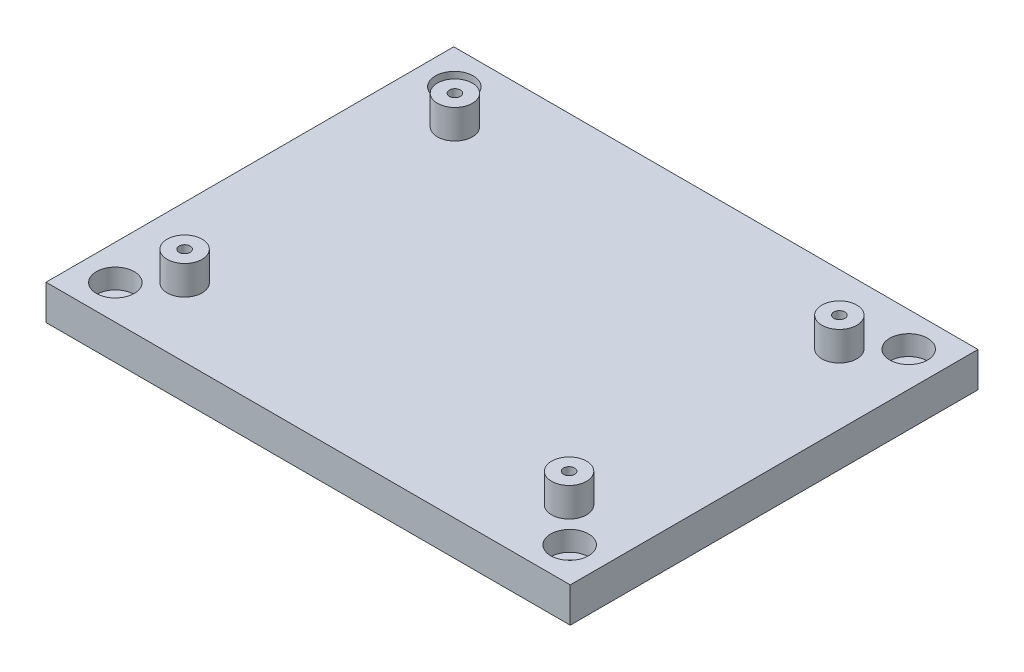
ISO-10303-21;
HEADER;
FILE_DESCRIPTION(('STEP AP214'),'2;1');
FILE_NAME('part.step','',(''),(''),'','','');
FILE_SCHEMA(('AUTOMOTIVE_DESIGN { 1 0 10303 214 1 1 1 1 }'));
ENDSEC;
DATA;
#1=APPLICATION_CONTEXT('core data for automotive mechanical design processes');
#2=APPLICATION_PROTOCOL_DEFINITION('international standard','automotive_design',2000,#1);
#3=PRODUCT_CONTEXT('',#1,'mechanical');
#4=PRODUCT('Part','Part','',(#3));
#5=PRODUCT_RELATED_PRODUCT_CATEGORY('part','',(#4));
#6=PRODUCT_DEFINITION_FORMATION('','',#4);
#7=PRODUCT_DEFINITION_CONTEXT('part definition',#1,'design');
#8=PRODUCT_DEFINITION('design','',#6,#7);
#9=PRODUCT_DEFINITION_SHAPE('','',#8);
#10=(LENGTH_UNIT() NAMED_UNIT(*) SI_UNIT(.MILLI.,.METRE.));
#11=(NAMED_UNIT(*) PLANE_ANGLE_UNIT() SI_UNIT($,.RADIAN.));
#12=(NAMED_UNIT(*) SI_UNIT($,.STERADIAN.) SOLID_ANGLE_UNIT());
#13=UNCERTAINTY_MEASURE_WITH_UNIT(LENGTH_MEASURE(1.E-05),#10,'distance_accuracy_value','');
#14=(GEOMETRIC_REPRESENTATION_CONTEXT(3) GLOBAL_UNCERTAINTY_ASSIGNED_CONTEXT((#13)) GLOBAL_UNIT_ASSIGNED_CONTEXT((#10,
#11,#12)) REPRESENTATION_CONTEXT('',''));
#15=CARTESIAN_POINT('',(0.,0.,0.));
#16=DIRECTION('',(0.,0.,1.));
#17=DIRECTION('',(1.,0.,0.));
#18=AXIS2_PLACEMENT_3D('',#15,#16,#17);
#19=CARTESIAN_POINT('',(-45.,6.,-35.));
#20=DIRECTION('',(1.,0.,0.));
#21=DIRECTION('',(0.,0.,-1.));
#22=AXIS2_PLACEMENT_3D('',#19,#20,#21);
#23=PLANE('',#22);
#24=DIRECTION('',(0.,0.,1.));
#25=VECTOR('',#24,1.);
#26=CARTESIAN_POINT('',(-45.,0.,-35.));
#27=LINE('',#26,#25);
#28=CARTESIAN_POINT('',(-45.,0.,-35.));
#29=VERTEX_POINT('',#28);
#30=CARTESIAN_POINT('',(-45.,0.,35.));
#31=VERTEX_POINT('',#30);
#32=EDGE_CURVE('E108',#29,#31,#27,.T.);
#33=ORIENTED_EDGE('',*,*,#32,.T.);
#34=DIRECTION('',(0.,-1.,0.));
#35=VECTOR('',#34,1.);
#36=CARTESIAN_POINT('',(-45.,6.,35.));
#37=LINE('',#36,#35);
#38=CARTESIAN_POINT('',(-45.,6.,35.));
#39=VERTEX_POINT('',#38);
#40=EDGE_CURVE('E99',#39,#31,#37,.T.);
#41=ORIENTED_EDGE('',*,*,#40,.F.);
#42=DIRECTION('',(0.,0.,1.));
#43=VECTOR('',#42,1.);
#44=CARTESIAN_POINT('',(-45.,6.,-35.));
#45=LINE('',#44,#43);
#46=CARTESIAN_POINT('',(-45.,6.,-35.));
#47=VERTEX_POINT('',#46);
#48=EDGE_CURVE('E93',#47,#39,#45,.T.);
#49=ORIENTED_EDGE('',*,*,#48,.F.);
#50=DIRECTION('',(0.,-1.,0.));
#51=VECTOR('',#50,1.);
#52=CARTESIAN_POINT('',(-45.,6.,-35.));
#53=LINE('',#52,#51);
#54=EDGE_CURVE('E104',#47,#29,#53,.T.);
#55=ORIENTED_EDGE('',*,*,#54,.T.);
#56=EDGE_LOOP('',(#33,#41,#49,#55));
#57=FACE_BOUND('',#56,.T.);
#58=ADVANCED_FACE('F39',(#57),#23,.F.);
#59=CARTESIAN_POINT('',(-45.,6.,35.));
#60=DIRECTION('',(0.,0.,-1.));
#61=DIRECTION('',(-1.,0.,0.));
#62=AXIS2_PLACEMENT_3D('',#59,#60,#61);
#63=PLANE('',#62);
#64=DIRECTION('',(1.,0.,0.));
#65=VECTOR('',#64,1.);
#66=CARTESIAN_POINT('',(-45.,0.,35.));
#67=LINE('',#66,#65);
#68=CARTESIAN_POINT('',(45.,0.,35.));
#69=VERTEX_POINT('',#68);
#70=EDGE_CURVE('E98',#31,#69,#67,.T.);
#71=ORIENTED_EDGE('',*,*,#70,.T.);
#72=DIRECTION('',(0.,-1.,0.));
#73=VECTOR('',#72,1.);
#74=CARTESIAN_POINT('',(45.,6.,35.));
#75=LINE('',#74,#73);
#76=CARTESIAN_POINT('',(45.,6.,35.));
#77=VERTEX_POINT('',#76);
#78=EDGE_CURVE('E96',#77,#69,#75,.T.);
#79=ORIENTED_EDGE('',*,*,#78,.F.);
#80=DIRECTION('',(1.,0.,0.));
#81=VECTOR('',#80,1.);
#82=CARTESIAN_POINT('',(-45.,6.,35.));
#83=LINE('',#82,#81);
#84=EDGE_CURVE('E88',#39,#77,#83,.T.);
#85=ORIENTED_EDGE('',*,*,#84,.F.);
#86=ORIENTED_EDGE('',*,*,#40,.T.);
#87=EDGE_LOOP('',(#71,#79,#85,#86));
#88=FACE_BOUND('',#87,.T.);
#89=ADVANCED_FACE('F97',(#88),#63,.F.);
#90=CARTESIAN_POINT('',(45.,6.,-35.));
#91=DIRECTION('',(-1.,0.,0.));
#92=DIRECTION('',(0.,0.,1.));
#93=AXIS2_PLACEMENT_3D('',#90,#91,#92);
#94=PLANE('',#93);
#95=DIRECTION('',(0.,0.,-1.));
#96=VECTOR('',#95,1.);
#97=CARTESIAN_POINT('',(45.,0.,-35.));
#98=LINE('',#97,#96);
#99=CARTESIAN_POINT('',(45.,0.,-35.));
#100=VERTEX_POINT('',#99);
#101=EDGE_CURVE('E74',#69,#100,#98,.T.);
#102=ORIENTED_EDGE('',*,*,#101,.T.);
#103=DIRECTION('',(0.,-1.,0.));
#104=VECTOR('',#103,1.);
#105=CARTESIAN_POINT('',(45.,6.,-35.));
#106=LINE('',#105,#104);
#107=CARTESIAN_POINT('',(45.,6.,-35.));
#108=VERTEX_POINT('',#107);
#109=EDGE_CURVE('E100',#108,#100,#106,.T.);
#110=ORIENTED_EDGE('',*,*,#109,.F.);
#111=DIRECTION('',(0.,0.,-1.));
#112=VECTOR('',#111,1.);
#113=CARTESIAN_POINT('',(45.,6.,-35.));
#114=LINE('',#113,#112);
#115=EDGE_CURVE('E91',#77,#108,#114,.T.);
#116=ORIENTED_EDGE('',*,*,#115,.F.);
#117=ORIENTED_EDGE('',*,*,#78,.T.);
#118=EDGE_LOOP('',(#102,#110,#116,#117));
#119=FACE_BOUND('',#118,.T.);
#120=ADVANCED_FACE('F102',(#119),#94,.F.);
#121=CARTESIAN_POINT('',(-45.,6.,-35.));
#122=DIRECTION('',(0.,0.,1.));
#123=DIRECTION('',(1.,0.,0.));
#124=AXIS2_PLACEMENT_3D('',#121,#122,#123);
#125=PLANE('',#124);
#126=DIRECTION('',(-1.,0.,0.));
#127=VECTOR('',#126,1.);
#128=CARTESIAN_POINT('',(-45.,0.,-35.));
#129=LINE('',#128,#127);
#130=EDGE_CURVE('E80',#100,#29,#129,.T.);
#131=ORIENTED_EDGE('',*,*,#130,.T.);
#132=ORIENTED_EDGE('',*,*,#54,.F.);
#133=DIRECTION('',(-1.,0.,0.));
#134=VECTOR('',#133,1.);
#135=CARTESIAN_POINT('',(-45.,6.,-35.));
#136=LINE('',#135,#134);
#137=EDGE_CURVE('E57',#108,#47,#136,.T.);
#138=ORIENTED_EDGE('',*,*,#137,.F.);
#139=ORIENTED_EDGE('',*,*,#109,.T.);
#140=EDGE_LOOP('',(#131,#132,#138,#139));
#141=FACE_BOUND('',#140,.T.);
#142=ADVANCED_FACE('F204',(#141),#125,.F.);
#143=CARTESIAN_POINT('',(0.,6.,0.));
#144=DIRECTION('',(0.,1.,0.));
#145=DIRECTION('',(0.,0.,1.));
#146=AXIS2_PLACEMENT_3D('',#143,#144,#145);
#147=PLANE('',#146);
#148=CARTESIAN_POINT('',(-39.,6.,-29.1));
#149=DIRECTION('',(0.,1.,0.));
#150=DIRECTION('',(0.,0.,1.));
#151=AXIS2_PLACEMENT_3D('',#148,#149,#150);
#152=CIRCLE('',#151,3.25);
#153=CARTESIAN_POINT('',(-39.,6.,-25.85));
#154=VERTEX_POINT('',#153);
#155=EDGE_CURVE('E536',#154,#154,#152,.T.);
#156=ORIENTED_EDGE('',*,*,#155,.F.);
#157=EDGE_LOOP('',(#156));
#158=FACE_BOUND('',#157,.T.);
#159=CARTESIAN_POINT('',(-39.,6.,29.1));
#160=DIRECTION('',(0.,1.,0.));
#161=DIRECTION('',(0.,0.,1.));
#162=AXIS2_PLACEMENT_3D('',#159,#160,#161);
#163=CIRCLE('',#162,3.25);
#164=CARTESIAN_POINT('',(-39.,6.,32.35));
#165=VERTEX_POINT('',#164);
#166=EDGE_CURVE('E150',#165,#165,#163,.T.);
#167=ORIENTED_EDGE('',*,*,#166,.F.);
#168=EDGE_LOOP('',(#167));
#169=FACE_BOUND('',#168,.T.);
#170=CARTESIAN_POINT('',(39.,6.,-29.1));
#171=DIRECTION('',(0.,1.,0.));
#172=DIRECTION('',(0.,0.,1.));
#173=AXIS2_PLACEMENT_3D('',#170,#171,#172);
#174=CIRCLE('',#173,3.25);
#175=CARTESIAN_POINT('',(39.,6.,-25.85));
#176=VERTEX_POINT('',#175);
#177=EDGE_CURVE('E137',#176,#176,#174,.T.);
#178=ORIENTED_EDGE('',*,*,#177,.F.);
#179=EDGE_LOOP('',(#178));
#180=FACE_BOUND('',#179,.T.);
#181=CARTESIAN_POINT('',(39.,6.,29.1));
#182=DIRECTION('',(0.,1.,0.));
#183=DIRECTION('',(0.,0.,1.));
#184=AXIS2_PLACEMENT_3D('',#181,#182,#183);
#185=CIRCLE('',#184,3.25);
#186=CARTESIAN_POINT('',(39.,6.,32.35));
#187=VERTEX_POINT('',#186);
#188=EDGE_CURVE('E133',#187,#187,#185,.T.);
#189=ORIENTED_EDGE('',*,*,#188,.F.);
#190=EDGE_LOOP('',(#189));
#191=FACE_BOUND('',#190,.T.);
#192=CARTESIAN_POINT('',(33.,6.,-23.2));
#193=DIRECTION('',(0.,1.,0.));
#194=DIRECTION('',(0.,0.,1.));
#195=AXIS2_PLACEMENT_3D('',#192,#193,#194);
#196=CIRCLE('',#195,3.);
#197=CARTESIAN_POINT('',(33.,6.,-20.2));
#198=VERTEX_POINT('',#197);
#199=EDGE_CURVE('E185',#198,#198,#196,.T.);
#200=ORIENTED_EDGE('',*,*,#199,.F.);
#201=EDGE_LOOP('',(#200));
#202=FACE_BOUND('',#201,.T.);
#203=CARTESIAN_POINT('',(33.,6.,23.2));
#204=DIRECTION('',(0.,1.,0.));
#205=DIRECTION('',(0.,0.,1.));
#206=AXIS2_PLACEMENT_3D('',#203,#204,#205);
#207=CIRCLE('',#206,3.);
#208=CARTESIAN_POINT('',(33.,6.,26.2));
#209=VERTEX_POINT('',#208);
#210=EDGE_CURVE('E176',#209,#209,#207,.T.);
#211=ORIENTED_EDGE('',*,*,#210,.F.);
#212=EDGE_LOOP('',(#211));
#213=FACE_BOUND('',#212,.T.);
#214=CARTESIAN_POINT('',(-33.,6.,23.2));
#215=DIRECTION('',(0.,1.,0.));
#216=DIRECTION('',(0.,0.,1.));
#217=AXIS2_PLACEMENT_3D('',#214,#215,#216);
#218=CIRCLE('',#217,3.);
#219=CARTESIAN_POINT('',(-33.,6.,26.2));
#220=VERTEX_POINT('',#219);
#221=EDGE_CURVE('E165',#220,#220,#218,.T.);
#222=ORIENTED_EDGE('',*,*,#221,.F.);
#223=EDGE_LOOP('',(#222));
#224=FACE_BOUND('',#223,.T.);
#225=CARTESIAN_POINT('',(-33.,6.,-23.2));
#226=DIRECTION('',(0.,1.,0.));
#227=DIRECTION('',(0.,0.,1.));
#228=AXIS2_PLACEMENT_3D('',#225,#226,#227);
#229=CIRCLE('',#228,3.);
#230=CARTESIAN_POINT('',(-33.,6.,-20.2));
#231=VERTEX_POINT('',#230);
#232=EDGE_CURVE('E194',#231,#231,#229,.T.);
#233=ORIENTED_EDGE('',*,*,#232,.F.);
#234=EDGE_LOOP('',(#233));
#235=FACE_BOUND('',#234,.T.);
#236=ORIENTED_EDGE('',*,*,#48,.T.);
#237=ORIENTED_EDGE('',*,*,#84,.T.);
#238=ORIENTED_EDGE('',*,*,#115,.T.);
#239=ORIENTED_EDGE('',*,*,#137,.T.);
#240=EDGE_LOOP('',(#236,#237,#238,#239));
#241=FACE_BOUND('',#240,.T.);
#242=ADVANCED_FACE('F89',(#158,#169,#180,#191,#202,#213,#224,#235,#241),#147,.T.);
#243=CARTESIAN_POINT('',(0.,0.,0.));
#244=DIRECTION('',(0.,1.,0.));
#245=DIRECTION('',(0.,0.,1.));
#246=AXIS2_PLACEMENT_3D('',#243,#244,#245);
#247=PLANE('',#246);
#248=CARTESIAN_POINT('',(-39.,0.,-29.1));
#249=DIRECTION('',(0.,1.,0.));
#250=DIRECTION('',(0.,0.,1.));
#251=AXIS2_PLACEMENT_3D('',#248,#249,#250);
#252=CIRCLE('',#251,1.6);
#253=CARTESIAN_POINT('',(-39.,0.,-27.5));
#254=VERTEX_POINT('',#253);
#255=EDGE_CURVE('E42',#254,#254,#252,.T.);
#256=ORIENTED_EDGE('',*,*,#255,.T.);
#257=EDGE_LOOP('',(#256));
#258=FACE_BOUND('',#257,.T.);
#259=CARTESIAN_POINT('',(-39.,0.,29.1));
#260=DIRECTION('',(0.,1.,0.));
#261=DIRECTION('',(0.,0.,1.));
#262=AXIS2_PLACEMENT_3D('',#259,#260,#261);
#263=CIRCLE('',#262,1.6);
#264=CARTESIAN_POINT('',(-39.,0.,30.7));
#265=VERTEX_POINT('',#264);
#266=EDGE_CURVE('E135',#265,#265,#263,.T.);
#267=ORIENTED_EDGE('',*,*,#266,.T.);
#268=EDGE_LOOP('',(#267));
#269=FACE_BOUND('',#268,.T.);
#270=CARTESIAN_POINT('',(39.,0.,-29.1));
#271=DIRECTION('',(0.,1.,0.));
#272=DIRECTION('',(0.,0.,1.));
#273=AXIS2_PLACEMENT_3D('',#270,#271,#272);
#274=CIRCLE('',#273,1.6);
#275=CARTESIAN_POINT('',(39.,0.,-27.5));
#276=VERTEX_POINT('',#275);
#277=EDGE_CURVE('E131',#276,#276,#274,.T.);
#278=ORIENTED_EDGE('',*,*,#277,.T.);
#279=EDGE_LOOP('',(#278));
#280=FACE_BOUND('',#279,.T.);
#281=CARTESIAN_POINT('',(39.,0.,29.1));
#282=DIRECTION('',(0.,1.,0.));
#283=DIRECTION('',(0.,0.,1.));
#284=AXIS2_PLACEMENT_3D('',#281,#282,#283);
#285=CIRCLE('',#284,1.6);
#286=CARTESIAN_POINT('',(39.,0.,30.7));
#287=VERTEX_POINT('',#286);
#288=EDGE_CURVE('E126',#287,#287,#285,.T.);
#289=ORIENTED_EDGE('',*,*,#288,.T.);
#290=EDGE_LOOP('',(#289));
#291=FACE_BOUND('',#290,.T.);
#292=ORIENTED_EDGE('',*,*,#32,.F.);
#293=ORIENTED_EDGE('',*,*,#130,.F.);
#294=ORIENTED_EDGE('',*,*,#101,.F.);
#295=ORIENTED_EDGE('',*,*,#70,.F.);
#296=EDGE_LOOP('',(#292,#293,#294,#295));
#297=FACE_BOUND('',#296,.T.);
#298=ADVANCED_FACE('F203',(#258,#269,#280,#291,#297),#247,.F.);
#299=CARTESIAN_POINT('',(-33.,11.,-23.2));
#300=DIRECTION('',(0.,1.,0.));
#301=DIRECTION('',(0.,0.,1.));
#302=AXIS2_PLACEMENT_3D('',#299,#300,#301);
#303=PLANE('',#302);
#304=CARTESIAN_POINT('',(-33.,11.,-23.2));
#305=DIRECTION('',(0.,1.,0.));
#306=DIRECTION('',(0.,0.,1.));
#307=AXIS2_PLACEMENT_3D('',#304,#305,#306);
#308=CIRCLE('',#307,3.);
#309=CARTESIAN_POINT('',(-33.,11.,-20.2));
#310=VERTEX_POINT('',#309);
#311=EDGE_CURVE('E111',#310,#310,#308,.T.);
#312=ORIENTED_EDGE('',*,*,#311,.T.);
#313=EDGE_LOOP('',(#312));
#314=FACE_BOUND('',#313,.T.);
#315=CARTESIAN_POINT('',(-33.,11.,-23.2));
#316=DIRECTION('',(0.,1.,0.));
#317=DIRECTION('',(0.,0.,1.));
#318=AXIS2_PLACEMENT_3D('',#315,#316,#317);
#319=CIRCLE('',#318,0.950000000000001);
#320=CARTESIAN_POINT('',(-33.,11.,-22.25));
#321=VERTEX_POINT('',#320);
#322=EDGE_CURVE('E175',#321,#321,#319,.T.);
#323=ORIENTED_EDGE('',*,*,#322,.F.);
#324=EDGE_LOOP('',(#323));
#325=FACE_BOUND('',#324,.T.);
#326=ADVANCED_FACE('F213',(#314,#325),#303,.T.);
#327=CARTESIAN_POINT('',(-33.,11.,-23.2));
#328=DIRECTION('',(0.,-1.,0.));
#329=DIRECTION('',(0.,0.,-1.));
#330=AXIS2_PLACEMENT_3D('',#327,#328,#329);
#331=CYLINDRICAL_SURFACE('',#330,3.);
#332=ORIENTED_EDGE('',*,*,#311,.F.);
#333=EDGE_LOOP('',(#332));
#334=FACE_BOUND('',#333,.T.);
#335=ORIENTED_EDGE('',*,*,#232,.T.);
#336=EDGE_LOOP('',(#335));
#337=FACE_BOUND('',#336,.T.);
#338=ADVANCED_FACE('F200',(#334,#337),#331,.T.);
#339=CARTESIAN_POINT('',(-33.,11.,-23.2));
#340=DIRECTION('',(0.,-1.,0.));
#341=DIRECTION('',(0.,0.,-1.));
#342=AXIS2_PLACEMENT_3D('',#339,#340,#341);
#343=CYLINDRICAL_SURFACE('',#342,0.950000000000001);
#344=ORIENTED_EDGE('',*,*,#322,.T.);
#345=EDGE_LOOP('',(#344));
#346=FACE_BOUND('',#345,.T.);
#347=CARTESIAN_POINT('',(-33.,6.,-23.2));
#348=DIRECTION('',(0.,1.,0.));
#349=DIRECTION('',(0.,0.,1.));
#350=AXIS2_PLACEMENT_3D('',#347,#348,#349);
#351=CIRCLE('',#350,0.950000000000001);
#352=CARTESIAN_POINT('',(-33.,6.,-22.25));
#353=VERTEX_POINT('',#352);
#354=EDGE_CURVE('E118',#353,#353,#351,.F.);
#355=ORIENTED_EDGE('',*,*,#354,.T.);
#356=EDGE_LOOP('',(#355));
#357=FACE_BOUND('',#356,.T.);
#358=ADVANCED_FACE('F227',(#346,#357),#343,.F.);
#359=ORIENTED_EDGE('',*,*,#354,.F.);
#360=EDGE_LOOP('',(#359));
#361=FACE_BOUND('',#360,.T.);
#362=ADVANCED_FACE('F208',(#361),#147,.T.);
#363=CARTESIAN_POINT('',(-33.,11.,23.2));
#364=DIRECTION('',(0.,1.,0.));
#365=DIRECTION('',(0.,0.,1.));
#366=AXIS2_PLACEMENT_3D('',#363,#364,#365);
#367=PLANE('',#366);
#368=CARTESIAN_POINT('',(-33.,11.,23.2));
#369=DIRECTION('',(0.,1.,0.));
#370=DIRECTION('',(0.,0.,1.));
#371=AXIS2_PLACEMENT_3D('',#368,#369,#370);
#372=CIRCLE('',#371,3.);
#373=CARTESIAN_POINT('',(-33.,11.,26.2));
#374=VERTEX_POINT('',#373);
#375=EDGE_CURVE('E169',#374,#374,#372,.T.);
#376=ORIENTED_EDGE('',*,*,#375,.T.);
#377=EDGE_LOOP('',(#376));
#378=FACE_BOUND('',#377,.T.);
#379=CARTESIAN_POINT('',(-33.,11.,23.2));
#380=DIRECTION('',(0.,1.,0.));
#381=DIRECTION('',(0.,0.,1.));
#382=AXIS2_PLACEMENT_3D('',#379,#380,#381);
#383=CIRCLE('',#382,0.950000000000001);
#384=CARTESIAN_POINT('',(-33.,11.,24.15));
#385=VERTEX_POINT('',#384);
#386=EDGE_CURVE('E168',#385,#385,#383,.T.);
#387=ORIENTED_EDGE('',*,*,#386,.F.);
#388=EDGE_LOOP('',(#387));
#389=FACE_BOUND('',#388,.T.);
#390=ADVANCED_FACE('F226',(#378,#389),#367,.T.);
#391=CARTESIAN_POINT('',(-33.,11.,23.2));
#392=DIRECTION('',(0.,-1.,0.));
#393=DIRECTION('',(0.,0.,-1.));
#394=AXIS2_PLACEMENT_3D('',#391,#392,#393);
#395=CYLINDRICAL_SURFACE('',#394,3.);
#396=ORIENTED_EDGE('',*,*,#375,.F.);
#397=EDGE_LOOP('',(#396));
#398=FACE_BOUND('',#397,.T.);
#399=ORIENTED_EDGE('',*,*,#221,.T.);
#400=EDGE_LOOP('',(#399));
#401=FACE_BOUND('',#400,.T.);
#402=ADVANCED_FACE('F285',(#398,#401),#395,.T.);
#403=CARTESIAN_POINT('',(-33.,11.,23.2));
#404=DIRECTION('',(0.,-1.,0.));
#405=DIRECTION('',(0.,0.,-1.));
#406=AXIS2_PLACEMENT_3D('',#403,#404,#405);
#407=CYLINDRICAL_SURFACE('',#406,0.950000000000001);
#408=ORIENTED_EDGE('',*,*,#386,.T.);
#409=EDGE_LOOP('',(#408));
#410=FACE_BOUND('',#409,.T.);
#411=CARTESIAN_POINT('',(-33.,6.,23.2));
#412=DIRECTION('',(0.,1.,0.));
#413=DIRECTION('',(0.,0.,1.));
#414=AXIS2_PLACEMENT_3D('',#411,#412,#413);
#415=CIRCLE('',#414,0.950000000000001);
#416=CARTESIAN_POINT('',(-33.,6.,24.15));
#417=VERTEX_POINT('',#416);
#418=EDGE_CURVE('E121',#417,#417,#415,.F.);
#419=ORIENTED_EDGE('',*,*,#418,.T.);
#420=EDGE_LOOP('',(#419));
#421=FACE_BOUND('',#420,.T.);
#422=ADVANCED_FACE('F294',(#410,#421),#407,.F.);
#423=ORIENTED_EDGE('',*,*,#418,.F.);
#424=EDGE_LOOP('',(#423));
#425=FACE_BOUND('',#424,.T.);
#426=ADVANCED_FACE('F229',(#425),#147,.T.);
#427=CARTESIAN_POINT('',(33.,11.,23.2));
#428=DIRECTION('',(0.,1.,0.));
#429=DIRECTION('',(0.,0.,1.));
#430=AXIS2_PLACEMENT_3D('',#427,#428,#429);
#431=PLANE('',#430);
#432=CARTESIAN_POINT('',(33.,11.,23.2));
#433=DIRECTION('',(0.,1.,0.));
#434=DIRECTION('',(0.,0.,1.));
#435=AXIS2_PLACEMENT_3D('',#432,#433,#434);
#436=CIRCLE('',#435,3.);
#437=CARTESIAN_POINT('',(33.,11.,26.2));
#438=VERTEX_POINT('',#437);
#439=EDGE_CURVE('E179',#438,#438,#436,.T.);
#440=ORIENTED_EDGE('',*,*,#439,.T.);
#441=EDGE_LOOP('',(#440));
#442=FACE_BOUND('',#441,.T.);
#443=CARTESIAN_POINT('',(33.,11.,23.2));
#444=DIRECTION('',(0.,1.,0.));
#445=DIRECTION('',(0.,0.,1.));
#446=AXIS2_PLACEMENT_3D('',#443,#444,#445);
#447=CIRCLE('',#446,0.950000000000001);
#448=CARTESIAN_POINT('',(33.,11.,24.15));
#449=VERTEX_POINT('',#448);
#450=EDGE_CURVE('E172',#449,#449,#447,.T.);
#451=ORIENTED_EDGE('',*,*,#450,.F.);
#452=EDGE_LOOP('',(#451));
#453=FACE_BOUND('',#452,.T.);
#454=ADVANCED_FACE('F311',(#442,#453),#431,.T.);
#455=CARTESIAN_POINT('',(33.,11.,23.2));
#456=DIRECTION('',(0.,-1.,0.));
#457=DIRECTION('',(0.,0.,-1.));
#458=AXIS2_PLACEMENT_3D('',#455,#456,#457);
#459=CYLINDRICAL_SURFACE('',#458,3.);
#460=ORIENTED_EDGE('',*,*,#439,.F.);
#461=EDGE_LOOP('',(#460));
#462=FACE_BOUND('',#461,.T.);
#463=ORIENTED_EDGE('',*,*,#210,.T.);
#464=EDGE_LOOP('',(#463));
#465=FACE_BOUND('',#464,.T.);
#466=ADVANCED_FACE('F318',(#462,#465),#459,.T.);
#467=CARTESIAN_POINT('',(33.,11.,23.2));
#468=DIRECTION('',(0.,-1.,0.));
#469=DIRECTION('',(0.,0.,-1.));
#470=AXIS2_PLACEMENT_3D('',#467,#468,#469);
#471=CYLINDRICAL_SURFACE('',#470,0.950000000000001);
#472=ORIENTED_EDGE('',*,*,#450,.T.);
#473=EDGE_LOOP('',(#472));
#474=FACE_BOUND('',#473,.T.);
#475=CARTESIAN_POINT('',(33.,6.,23.2));
#476=DIRECTION('',(0.,1.,0.));
#477=DIRECTION('',(0.,0.,1.));
#478=AXIS2_PLACEMENT_3D('',#475,#476,#477);
#479=CIRCLE('',#478,0.950000000000001);
#480=CARTESIAN_POINT('',(33.,6.,24.15));
#481=VERTEX_POINT('',#480);
#482=EDGE_CURVE('E48',#481,#481,#479,.F.);
#483=ORIENTED_EDGE('',*,*,#482,.T.);
#484=EDGE_LOOP('',(#483));
#485=FACE_BOUND('',#484,.T.);
#486=ADVANCED_FACE('F327',(#474,#485),#471,.F.);
#487=ORIENTED_EDGE('',*,*,#482,.F.);
#488=EDGE_LOOP('',(#487));
#489=FACE_BOUND('',#488,.T.);
#490=ADVANCED_FACE('F224',(#489),#147,.T.);
#491=CARTESIAN_POINT('',(33.,11.,-23.2));
#492=DIRECTION('',(0.,1.,0.));
#493=DIRECTION('',(0.,0.,1.));
#494=AXIS2_PLACEMENT_3D('',#491,#492,#493);
#495=PLANE('',#494);
#496=CARTESIAN_POINT('',(33.,11.,-23.2));
#497=DIRECTION('',(0.,1.,0.));
#498=DIRECTION('',(0.,0.,1.));
#499=AXIS2_PLACEMENT_3D('',#496,#497,#498);
#500=CIRCLE('',#499,3.);
#501=CARTESIAN_POINT('',(33.,11.,-20.2));
#502=VERTEX_POINT('',#501);
#503=EDGE_CURVE('E129',#502,#502,#500,.T.);
#504=ORIENTED_EDGE('',*,*,#503,.T.);
#505=EDGE_LOOP('',(#504));
#506=FACE_BOUND('',#505,.T.);
#507=CARTESIAN_POINT('',(33.,11.,-23.2));
#508=DIRECTION('',(0.,1.,0.));
#509=DIRECTION('',(0.,0.,1.));
#510=AXIS2_PLACEMENT_3D('',#507,#508,#509);
#511=CIRCLE('',#510,0.950000000000001);
#512=CARTESIAN_POINT('',(33.,11.,-22.25));
#513=VERTEX_POINT('',#512);
#514=EDGE_CURVE('E182',#513,#513,#511,.T.);
#515=ORIENTED_EDGE('',*,*,#514,.F.);
#516=EDGE_LOOP('',(#515));
#517=FACE_BOUND('',#516,.T.);
#518=ADVANCED_FACE('F344',(#506,#517),#495,.T.);
#519=CARTESIAN_POINT('',(33.,11.,-23.2));
#520=DIRECTION('',(0.,-1.,0.));
#521=DIRECTION('',(0.,0.,-1.));
#522=AXIS2_PLACEMENT_3D('',#519,#520,#521);
#523=CYLINDRICAL_SURFACE('',#522,3.);
#524=ORIENTED_EDGE('',*,*,#503,.F.);
#525=EDGE_LOOP('',(#524));
#526=FACE_BOUND('',#525,.T.);
#527=ORIENTED_EDGE('',*,*,#199,.T.);
#528=EDGE_LOOP('',(#527));
#529=FACE_BOUND('',#528,.T.);
#530=ADVANCED_FACE('F351',(#526,#529),#523,.T.);
#531=CARTESIAN_POINT('',(33.,11.,-23.2));
#532=DIRECTION('',(0.,-1.,0.));
#533=DIRECTION('',(0.,0.,-1.));
#534=AXIS2_PLACEMENT_3D('',#531,#532,#533);
#535=CYLINDRICAL_SURFACE('',#534,0.950000000000001);
#536=ORIENTED_EDGE('',*,*,#514,.T.);
#537=EDGE_LOOP('',(#536));
#538=FACE_BOUND('',#537,.T.);
#539=CARTESIAN_POINT('',(33.,6.,-23.2));
#540=DIRECTION('',(0.,1.,0.));
#541=DIRECTION('',(0.,0.,1.));
#542=AXIS2_PLACEMENT_3D('',#539,#540,#541);
#543=CIRCLE('',#542,0.950000000000001);
#544=CARTESIAN_POINT('',(33.,6.,-22.25));
#545=VERTEX_POINT('',#544);
#546=EDGE_CURVE('E11',#545,#545,#543,.F.);
#547=ORIENTED_EDGE('',*,*,#546,.T.);
#548=EDGE_LOOP('',(#547));
#549=FACE_BOUND('',#548,.T.);
#550=ADVANCED_FACE('F222',(#538,#549),#535,.F.);
#551=ORIENTED_EDGE('',*,*,#546,.F.);
#552=EDGE_LOOP('',(#551));
#553=FACE_BOUND('',#552,.T.);
#554=ADVANCED_FACE('F207',(#553),#147,.T.);
#555=CARTESIAN_POINT('',(39.,6.,29.1));
#556=DIRECTION('',(0.,1.,0.));
#557=DIRECTION('',(0.,0.,1.));
#558=AXIS2_PLACEMENT_3D('',#555,#556,#557);
#559=CYLINDRICAL_SURFACE('',#558,1.6);
#560=CARTESIAN_POINT('',(39.,2.6,29.1));
#561=DIRECTION('',(0.,1.,0.));
#562=DIRECTION('',(0.,0.,1.));
#563=AXIS2_PLACEMENT_3D('',#560,#561,#562);
#564=CIRCLE('',#563,1.6);
#565=CARTESIAN_POINT('',(39.,2.6,30.7));
#566=VERTEX_POINT('',#565);
#567=EDGE_CURVE('E130',#566,#566,#564,.T.);
#568=ORIENTED_EDGE('',*,*,#567,.T.);
#569=EDGE_LOOP('',(#568));
#570=FACE_BOUND('',#569,.T.);
#571=ORIENTED_EDGE('',*,*,#288,.F.);
#572=EDGE_LOOP('',(#571));
#573=FACE_BOUND('',#572,.T.);
#574=ADVANCED_FACE('F221',(#570,#573),#559,.F.);
#575=CARTESIAN_POINT('',(40.6,2.6,29.1));
#576=DIRECTION('',(0.,-1.,0.));
#577=DIRECTION('',(0.,0.,-1.));
#578=AXIS2_PLACEMENT_3D('',#575,#576,#577);
#579=PLANE('',#578);
#580=ORIENTED_EDGE('',*,*,#567,.F.);
#581=EDGE_LOOP('',(#580));
#582=FACE_BOUND('',#581,.T.);
#583=CARTESIAN_POINT('',(39.,2.6,29.1));
#584=DIRECTION('',(0.,1.,0.));
#585=DIRECTION('',(0.,0.,1.));
#586=AXIS2_PLACEMENT_3D('',#583,#584,#585);
#587=CIRCLE('',#586,3.25);
#588=CARTESIAN_POINT('',(39.,2.6,32.35));
#589=VERTEX_POINT('',#588);
#590=EDGE_CURVE('E160',#589,#589,#587,.T.);
#591=ORIENTED_EDGE('',*,*,#590,.T.);
#592=EDGE_LOOP('',(#591));
#593=FACE_BOUND('',#592,.T.);
#594=ADVANCED_FACE('F393',(#582,#593),#579,.F.);
#595=CARTESIAN_POINT('',(39.,6.,29.1));
#596=DIRECTION('',(0.,1.,0.));
#597=DIRECTION('',(0.,0.,1.));
#598=AXIS2_PLACEMENT_3D('',#595,#596,#597);
#599=CYLINDRICAL_SURFACE('',#598,3.25);
#600=ORIENTED_EDGE('',*,*,#590,.F.);
#601=EDGE_LOOP('',(#600));
#602=FACE_BOUND('',#601,.T.);
#603=ORIENTED_EDGE('',*,*,#188,.T.);
#604=EDGE_LOOP('',(#603));
#605=FACE_BOUND('',#604,.T.);
#606=ADVANCED_FACE('F402',(#602,#605),#599,.F.);
#607=CARTESIAN_POINT('',(39.,6.,-29.1));
#608=DIRECTION('',(0.,1.,0.));
#609=DIRECTION('',(0.,0.,1.));
#610=AXIS2_PLACEMENT_3D('',#607,#608,#609);
#611=CYLINDRICAL_SURFACE('',#610,1.6);
#612=CARTESIAN_POINT('',(39.,2.6,-29.1));
#613=DIRECTION('',(0.,1.,0.));
#614=DIRECTION('',(0.,0.,1.));
#615=AXIS2_PLACEMENT_3D('',#612,#613,#614);
#616=CIRCLE('',#615,1.6);
#617=CARTESIAN_POINT('',(39.,2.6,-27.5));
#618=VERTEX_POINT('',#617);
#619=EDGE_CURVE('E134',#618,#618,#616,.T.);
#620=ORIENTED_EDGE('',*,*,#619,.T.);
#621=EDGE_LOOP('',(#620));
#622=FACE_BOUND('',#621,.T.);
#623=ORIENTED_EDGE('',*,*,#277,.F.);
#624=EDGE_LOOP('',(#623));
#625=FACE_BOUND('',#624,.T.);
#626=ADVANCED_FACE('F411',(#622,#625),#611,.F.);
#627=CARTESIAN_POINT('',(40.6,2.6,-29.1));
#628=DIRECTION('',(0.,-1.,0.));
#629=DIRECTION('',(0.,0.,-1.));
#630=AXIS2_PLACEMENT_3D('',#627,#628,#629);
#631=PLANE('',#630);
#632=ORIENTED_EDGE('',*,*,#619,.F.);
#633=EDGE_LOOP('',(#632));
#634=FACE_BOUND('',#633,.T.);
#635=CARTESIAN_POINT('',(39.,2.6,-29.1));
#636=DIRECTION('',(0.,1.,0.));
#637=DIRECTION('',(0.,0.,1.));
#638=AXIS2_PLACEMENT_3D('',#635,#636,#637);
#639=CIRCLE('',#638,3.25);
#640=CARTESIAN_POINT('',(39.,2.6,-25.85));
#641=VERTEX_POINT('',#640);
#642=EDGE_CURVE('E142',#641,#641,#639,.T.);
#643=ORIENTED_EDGE('',*,*,#642,.T.);
#644=EDGE_LOOP('',(#643));
#645=FACE_BOUND('',#644,.T.);
#646=ADVANCED_FACE('F420',(#634,#645),#631,.F.);
#647=CARTESIAN_POINT('',(39.,6.,-29.1));
#648=DIRECTION('',(0.,1.,0.));
#649=DIRECTION('',(0.,0.,1.));
#650=AXIS2_PLACEMENT_3D('',#647,#648,#649);
#651=CYLINDRICAL_SURFACE('',#650,3.25);
#652=ORIENTED_EDGE('',*,*,#642,.F.);
#653=EDGE_LOOP('',(#652));
#654=FACE_BOUND('',#653,.T.);
#655=ORIENTED_EDGE('',*,*,#177,.T.);
#656=EDGE_LOOP('',(#655));
#657=FACE_BOUND('',#656,.T.);
#658=ADVANCED_FACE('F429',(#654,#657),#651,.F.);
#659=CARTESIAN_POINT('',(-39.,6.,29.1));
#660=DIRECTION('',(0.,1.,0.));
#661=DIRECTION('',(0.,0.,1.));
#662=AXIS2_PLACEMENT_3D('',#659,#660,#661);
#663=CYLINDRICAL_SURFACE('',#662,1.6);
#664=CARTESIAN_POINT('',(-39.,2.6,29.1));
#665=DIRECTION('',(0.,1.,0.));
#666=DIRECTION('',(0.,0.,1.));
#667=AXIS2_PLACEMENT_3D('',#664,#665,#666);
#668=CIRCLE('',#667,1.6);
#669=CARTESIAN_POINT('',(-39.,2.6,30.7));
#670=VERTEX_POINT('',#669);
#671=EDGE_CURVE('E138',#670,#670,#668,.T.);
#672=ORIENTED_EDGE('',*,*,#671,.T.);
#673=EDGE_LOOP('',(#672));
#674=FACE_BOUND('',#673,.T.);
#675=ORIENTED_EDGE('',*,*,#266,.F.);
#676=EDGE_LOOP('',(#675));
#677=FACE_BOUND('',#676,.T.);
#678=ADVANCED_FACE('F438',(#674,#677),#663,.F.);
#679=CARTESIAN_POINT('',(-37.4,2.6,29.1));
#680=DIRECTION('',(0.,-1.,0.));
#681=DIRECTION('',(0.,0.,-1.));
#682=AXIS2_PLACEMENT_3D('',#679,#680,#681);
#683=PLANE('',#682);
#684=ORIENTED_EDGE('',*,*,#671,.F.);
#685=EDGE_LOOP('',(#684));
#686=FACE_BOUND('',#685,.T.);
#687=CARTESIAN_POINT('',(-39.,2.6,29.1));
#688=DIRECTION('',(0.,1.,0.));
#689=DIRECTION('',(0.,0.,1.));
#690=AXIS2_PLACEMENT_3D('',#687,#688,#689);
#691=CIRCLE('',#690,3.25);
#692=CARTESIAN_POINT('',(-39.,2.6,32.35));
#693=VERTEX_POINT('',#692);
#694=EDGE_CURVE('E145',#693,#693,#691,.T.);
#695=ORIENTED_EDGE('',*,*,#694,.T.);
#696=EDGE_LOOP('',(#695));
#697=FACE_BOUND('',#696,.T.);
#698=ADVANCED_FACE('F447',(#686,#697),#683,.F.);
#699=CARTESIAN_POINT('',(-39.,6.,29.1));
#700=DIRECTION('',(0.,1.,0.));
#701=DIRECTION('',(0.,0.,1.));
#702=AXIS2_PLACEMENT_3D('',#699,#700,#701);
#703=CYLINDRICAL_SURFACE('',#702,3.25);
#704=ORIENTED_EDGE('',*,*,#694,.F.);
#705=EDGE_LOOP('',(#704));
#706=FACE_BOUND('',#705,.T.);
#707=ORIENTED_EDGE('',*,*,#166,.T.);
#708=EDGE_LOOP('',(#707));
#709=FACE_BOUND('',#708,.T.);
#710=ADVANCED_FACE('F455',(#706,#709),#703,.F.);
#711=CARTESIAN_POINT('',(-39.,6.,-29.1));
#712=DIRECTION('',(0.,1.,0.));
#713=DIRECTION('',(0.,0.,1.));
#714=AXIS2_PLACEMENT_3D('',#711,#712,#713);
#715=CYLINDRICAL_SURFACE('',#714,1.6);
#716=CARTESIAN_POINT('',(-39.,2.6,-29.1));
#717=DIRECTION('',(0.,1.,0.));
#718=DIRECTION('',(0.,0.,1.));
#719=AXIS2_PLACEMENT_3D('',#716,#717,#718);
#720=CIRCLE('',#719,1.6);
#721=CARTESIAN_POINT('',(-39.,2.6,-27.5));
#722=VERTEX_POINT('',#721);
#723=EDGE_CURVE('E538',#722,#722,#720,.T.);
#724=ORIENTED_EDGE('',*,*,#723,.T.);
#725=EDGE_LOOP('',(#724));
#726=FACE_BOUND('',#725,.T.);
#727=ORIENTED_EDGE('',*,*,#255,.F.);
#728=EDGE_LOOP('',(#727));
#729=FACE_BOUND('',#728,.T.);
#730=ADVANCED_FACE('F464',(#726,#729),#715,.F.);
#731=CARTESIAN_POINT('',(-37.4,2.6,-29.1));
#732=DIRECTION('',(0.,-1.,0.));
#733=DIRECTION('',(0.,0.,-1.));
#734=AXIS2_PLACEMENT_3D('',#731,#732,#733);
#735=PLANE('',#734);
#736=ORIENTED_EDGE('',*,*,#723,.F.);
#737=EDGE_LOOP('',(#736));
#738=FACE_BOUND('',#737,.T.);
#739=CARTESIAN_POINT('',(-39.,2.6,-29.1));
#740=DIRECTION('',(0.,1.,0.));
#741=DIRECTION('',(0.,0.,1.));
#742=AXIS2_PLACEMENT_3D('',#739,#740,#741);
#743=CIRCLE('',#742,3.25);
#744=CARTESIAN_POINT('',(-39.,2.6,-25.85));
#745=VERTEX_POINT('',#744);
#746=EDGE_CURVE('E534',#745,#745,#743,.T.);
#747=ORIENTED_EDGE('',*,*,#746,.T.);
#748=EDGE_LOOP('',(#747));
#749=FACE_BOUND('',#748,.T.);
#750=ADVANCED_FACE('F473',(#738,#749),#735,.F.);
#751=CARTESIAN_POINT('',(-39.,6.,-29.1));
#752=DIRECTION('',(0.,1.,0.));
#753=DIRECTION('',(0.,0.,1.));
#754=AXIS2_PLACEMENT_3D('',#751,#752,#753);
#755=CYLINDRICAL_SURFACE('',#754,3.25);
#756=ORIENTED_EDGE('',*,*,#746,.F.);
#757=EDGE_LOOP('',(#756));
#758=FACE_BOUND('',#757,.T.);
#759=ORIENTED_EDGE('',*,*,#155,.T.);
#760=EDGE_LOOP('',(#759));
#761=FACE_BOUND('',#760,.T.);
#762=ADVANCED_FACE('F482',(#758,#761),#755,.F.);
#763=CLOSED_SHELL('',(#58,#89,#120,#142,#242,#298,#326,#338,#358,#362,#390,#402,#422,#426,#454,
#466,#486,#490,#518,#530,#550,#554,#574,#594,#606,#626,#646,#658,#678,#698,#710,#730,#750,#762));
#764=MANIFOLD_SOLID_BREP('B2',#763);
#765=ADVANCED_BREP_SHAPE_REPRESENTATION('',(#18,#764),#14);
#766=SHAPE_DEFINITION_REPRESENTATION(#9,#765);
ENDSEC;
END-ISO-10303-21;
